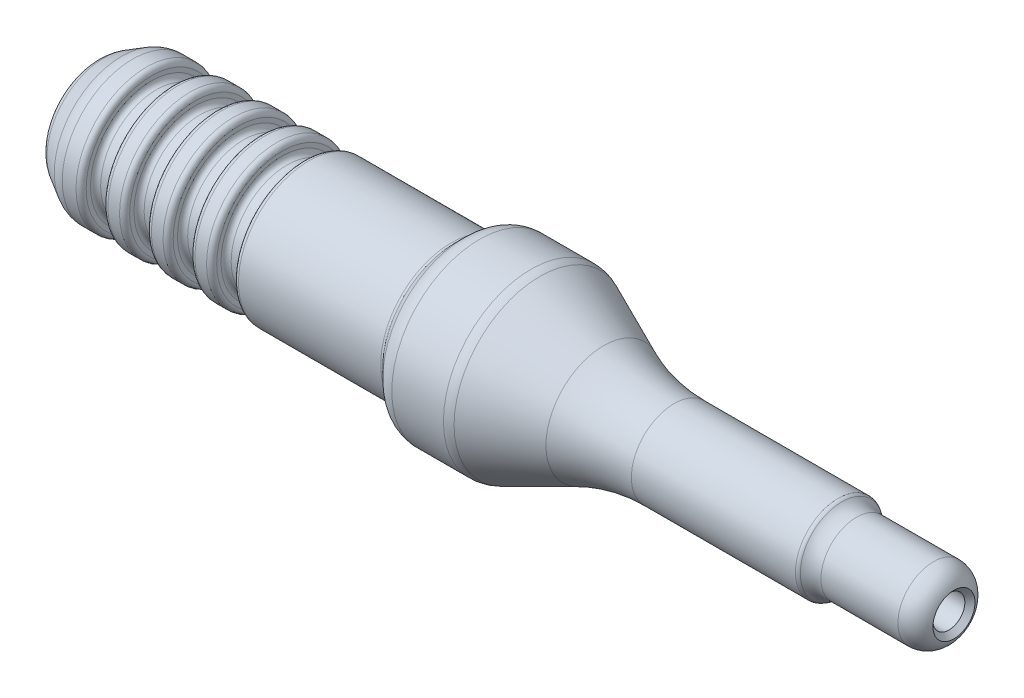
ISO-10303-21;
HEADER;
FILE_DESCRIPTION(('STEP AP214'),'2;1');
FILE_NAME('part.step','',(''),(''),'','','');
FILE_SCHEMA(('AUTOMOTIVE_DESIGN { 1 0 10303 214 1 1 1 1 }'));
ENDSEC;
DATA;
#1=APPLICATION_CONTEXT('core data for automotive mechanical design processes');
#2=APPLICATION_PROTOCOL_DEFINITION('international standard','automotive_design',2000,#1);
#3=PRODUCT_CONTEXT('',#1,'mechanical');
#4=PRODUCT('Part','Part','',(#3));
#5=PRODUCT_RELATED_PRODUCT_CATEGORY('part','',(#4));
#6=PRODUCT_DEFINITION_FORMATION('','',#4);
#7=PRODUCT_DEFINITION_CONTEXT('part definition',#1,'design');
#8=PRODUCT_DEFINITION('design','',#6,#7);
#9=PRODUCT_DEFINITION_SHAPE('','',#8);
#10=(LENGTH_UNIT() NAMED_UNIT(*) SI_UNIT(.MILLI.,.METRE.));
#11=(NAMED_UNIT(*) PLANE_ANGLE_UNIT() SI_UNIT($,.RADIAN.));
#12=(NAMED_UNIT(*) SI_UNIT($,.STERADIAN.) SOLID_ANGLE_UNIT());
#13=UNCERTAINTY_MEASURE_WITH_UNIT(LENGTH_MEASURE(1.E-05),#10,'distance_accuracy_value','');
#14=(GEOMETRIC_REPRESENTATION_CONTEXT(3) GLOBAL_UNCERTAINTY_ASSIGNED_CONTEXT((#13)) GLOBAL_UNIT_ASSIGNED_CONTEXT((#10,
#11,#12)) REPRESENTATION_CONTEXT('',''));
#15=CARTESIAN_POINT('',(0.,0.,0.));
#16=DIRECTION('',(0.,0.,1.));
#17=DIRECTION('',(1.,0.,0.));
#18=AXIS2_PLACEMENT_3D('',#15,#16,#17);
#19=CARTESIAN_POINT('',(59.3371706320249,0.,0.));
#20=DIRECTION('',(1.,0.,0.));
#21=DIRECTION('',(0.,0.,-1.));
#22=AXIS2_PLACEMENT_3D('',#19,#20,#21);
#23=CYLINDRICAL_SURFACE('',#22,4.84790561913614);
#24=CARTESIAN_POINT('',(14.85,0.,0.));
#25=DIRECTION('',(1.,0.,0.));
#26=DIRECTION('',(0.,0.,-1.));
#27=AXIS2_PLACEMENT_3D('',#24,#25,#26);
#28=CIRCLE('',#27,4.84790561913614);
#29=CARTESIAN_POINT('',(14.85,0.,-4.84790561913614));
#30=VERTEX_POINT('',#29);
#31=EDGE_CURVE('E132',#30,#30,#28,.T.);
#32=ORIENTED_EDGE('',*,*,#31,.T.);
#33=EDGE_LOOP('',(#32));
#34=FACE_BOUND('',#33,.T.);
#35=CARTESIAN_POINT('',(24.6550252531694,0.,0.));
#36=DIRECTION('',(1.,0.,0.));
#37=DIRECTION('',(0.,0.,-1.));
#38=AXIS2_PLACEMENT_3D('',#35,#36,#37);
#39=CIRCLE('',#38,4.84790561913614);
#40=CARTESIAN_POINT('',(24.6550252531694,0.,-4.84790561913614));
#41=VERTEX_POINT('',#40);
#42=EDGE_CURVE('E135',#41,#41,#39,.F.);
#43=ORIENTED_EDGE('',*,*,#42,.T.);
#44=EDGE_LOOP('',(#43));
#45=FACE_BOUND('',#44,.T.);
#46=ADVANCED_FACE('F34',(#34,#45),#23,.T.);
#47=CARTESIAN_POINT('',(26.,0.,0.));
#48=DIRECTION('',(1.,0.,0.));
#49=DIRECTION('',(0.,0.,-1.));
#50=AXIS2_PLACEMENT_3D('',#47,#48,#49);
#51=CONICAL_SURFACE('',#50,6.04790561913615,0.785398163397448);
#52=CARTESIAN_POINT('',(24.9025126265847,0.,0.));
#53=DIRECTION('',(1.,0.,0.));
#54=DIRECTION('',(0.,0.,-1.));
#55=AXIS2_PLACEMENT_3D('',#52,#53,#54);
#56=CIRCLE('',#55,4.95041824572085);
#57=CARTESIAN_POINT('',(24.9025126265847,0.,-4.95041824572085));
#58=VERTEX_POINT('',#57);
#59=EDGE_CURVE('E10',#58,#58,#56,.T.);
#60=ORIENTED_EDGE('',*,*,#59,.T.);
#61=EDGE_LOOP('',(#60));
#62=FACE_BOUND('',#61,.T.);
#63=CARTESIAN_POINT('',(25.5606601717798,0.,0.));
#64=DIRECTION('',(-1.,0.,0.));
#65=DIRECTION('',(0.,0.,1.));
#66=AXIS2_PLACEMENT_3D('',#63,#64,#65);
#67=CIRCLE('',#66,5.60856579091597);
#68=CARTESIAN_POINT('',(25.5606601717798,0.,5.60856579091597));
#69=VERTEX_POINT('',#68);
#70=EDGE_CURVE('E159',#69,#69,#67,.T.);
#71=ORIENTED_EDGE('',*,*,#70,.T.);
#72=EDGE_LOOP('',(#71));
#73=FACE_BOUND('',#72,.T.);
#74=ADVANCED_FACE('F218',(#62,#73),#51,.T.);
#75=CARTESIAN_POINT('',(59.3371706320249,0.,0.));
#76=DIRECTION('',(1.,0.,0.));
#77=DIRECTION('',(0.,0.,-1.));
#78=AXIS2_PLACEMENT_3D('',#75,#76,#77);
#79=CYLINDRICAL_SURFACE('',#78,6.04790561913615);
#80=CARTESIAN_POINT('',(26.6213203435596,0.,0.));
#81=DIRECTION('',(-1.,0.,0.));
#82=DIRECTION('',(0.,0.,1.));
#83=AXIS2_PLACEMENT_3D('',#80,#81,#82);
#84=CIRCLE('',#83,6.04790561913615);
#85=CARTESIAN_POINT('',(26.6213203435596,0.,6.04790561913615));
#86=VERTEX_POINT('',#85);
#87=EDGE_CURVE('E162',#86,#86,#84,.F.);
#88=ORIENTED_EDGE('',*,*,#87,.T.);
#89=EDGE_LOOP('',(#88));
#90=FACE_BOUND('',#89,.T.);
#91=CARTESIAN_POINT('',(30.182669802533,0.,0.));
#92=DIRECTION('',(-1.,0.,0.));
#93=DIRECTION('',(0.,0.,1.));
#94=AXIS2_PLACEMENT_3D('',#91,#92,#93);
#95=CIRCLE('',#94,6.04790561913615);
#96=CARTESIAN_POINT('',(30.182669802533,0.,6.04790561913615));
#97=VERTEX_POINT('',#96);
#98=EDGE_CURVE('E165',#97,#97,#95,.T.);
#99=ORIENTED_EDGE('',*,*,#98,.T.);
#100=EDGE_LOOP('',(#99));
#101=FACE_BOUND('',#100,.T.);
#102=ADVANCED_FACE('F226',(#90,#101),#79,.T.);
#103=CARTESIAN_POINT('',(37.5,0.,0.));
#104=DIRECTION('',(-1.,0.,0.));
#105=DIRECTION('',(0.,0.,1.));
#106=AXIS2_PLACEMENT_3D('',#103,#104,#105);
#107=CONICAL_SURFACE('',#106,2.94739412510884,0.416959158301446);
#108=CARTESIAN_POINT('',(30.7901428223222,0.,0.));
#109=DIRECTION('',(1.,0.,0.));
#110=DIRECTION('',(0.,0.,-1.));
#111=AXIS2_PLACEMENT_3D('',#108,#109,#110);
#112=CIRCLE('',#111,5.91939259691907);
#113=CARTESIAN_POINT('',(30.7901428223222,0.,-5.91939259691907));
#114=VERTEX_POINT('',#113);
#115=EDGE_CURVE('E156',#114,#114,#112,.T.);
#116=ORIENTED_EDGE('',*,*,#115,.T.);
#117=EDGE_LOOP('',(#116));
#118=FACE_BOUND('',#117,.T.);
#119=CARTESIAN_POINT('',(35.1788574214223,0.,0.));
#120=DIRECTION('',(-1.,0.,0.));
#121=DIRECTION('',(0.,0.,1.));
#122=AXIS2_PLACEMENT_3D('',#119,#120,#121);
#123=CIRCLE('',#122,3.97549830284546);
#124=CARTESIAN_POINT('',(35.1788574214223,0.,3.97549830284546));
#125=VERTEX_POINT('',#124);
#126=EDGE_CURVE('E183',#125,#125,#123,.T.);
#127=ORIENTED_EDGE('',*,*,#126,.T.);
#128=EDGE_LOOP('',(#127));
#129=FACE_BOUND('',#128,.T.);
#130=ADVANCED_FACE('F394',(#118,#129),#107,.T.);
#131=CARTESIAN_POINT('',(59.3371706320249,0.,0.));
#132=DIRECTION('',(1.,0.,0.));
#133=DIRECTION('',(0.,0.,-1.));
#134=AXIS2_PLACEMENT_3D('',#131,#132,#133);
#135=CYLINDRICAL_SURFACE('',#134,2.94739412510884);
#136=CARTESIAN_POINT('',(51.3535736046771,0.,0.));
#137=DIRECTION('',(-1.,0.,0.));
#138=DIRECTION('',(0.,0.,1.));
#139=AXIS2_PLACEMENT_3D('',#136,#137,#138);
#140=CIRCLE('',#139,2.94739412510884);
#141=CARTESIAN_POINT('',(51.3535736046771,0.,2.94739412510884));
#142=VERTEX_POINT('',#141);
#143=EDGE_CURVE('E41',#142,#142,#140,.T.);
#144=ORIENTED_EDGE('',*,*,#143,.T.);
#145=EDGE_LOOP('',(#144));
#146=FACE_BOUND('',#145,.T.);
#147=CARTESIAN_POINT('',(40.0386415797363,0.,0.));
#148=DIRECTION('',(1.,0.,0.));
#149=DIRECTION('',(0.,0.,-1.));
#150=AXIS2_PLACEMENT_3D('',#147,#148,#149);
#151=CIRCLE('',#150,2.94739412510884);
#152=CARTESIAN_POINT('',(40.0386415797363,0.,-2.94739412510884));
#153=VERTEX_POINT('',#152);
#154=EDGE_CURVE('E186',#153,#153,#151,.T.);
#155=ORIENTED_EDGE('',*,*,#154,.T.);
#156=EDGE_LOOP('',(#155));
#157=FACE_BOUND('',#156,.T.);
#158=ADVANCED_FACE('F385',(#146,#157),#135,.T.);
#159=CARTESIAN_POINT('',(59.3371706320249,0.,0.));
#160=DIRECTION('',(1.,0.,0.));
#161=DIRECTION('',(0.,0.,-1.));
#162=AXIS2_PLACEMENT_3D('',#159,#160,#161);
#163=CYLINDRICAL_SURFACE('',#162,2.45);
#164=CARTESIAN_POINT('',(57.9229570696518,0.,0.));
#165=DIRECTION('',(1.,0.,0.));
#166=DIRECTION('',(0.,0.,-1.));
#167=AXIS2_PLACEMENT_3D('',#164,#165,#166);
#168=CIRCLE('',#167,2.45);
#169=CARTESIAN_POINT('',(57.9229570696518,0.,-2.45));
#170=VERTEX_POINT('',#169);
#171=EDGE_CURVE('E150',#170,#170,#168,.F.);
#172=ORIENTED_EDGE('',*,*,#171,.T.);
#173=EDGE_LOOP('',(#172));
#174=FACE_BOUND('',#173,.T.);
#175=CARTESIAN_POINT('',(52.6156977456434,0.,0.));
#176=DIRECTION('',(-1.,0.,0.));
#177=DIRECTION('',(0.,0.,1.));
#178=AXIS2_PLACEMENT_3D('',#175,#176,#177);
#179=CIRCLE('',#178,2.45);
#180=CARTESIAN_POINT('',(52.6156977456434,0.,2.45));
#181=VERTEX_POINT('',#180);
#182=EDGE_CURVE('E153',#181,#181,#179,.F.);
#183=ORIENTED_EDGE('',*,*,#182,.T.);
#184=EDGE_LOOP('',(#183));
#185=FACE_BOUND('',#184,.T.);
#186=ADVANCED_FACE('F383',(#174,#185),#163,.T.);
#187=CARTESIAN_POINT('',(59.3371706320249,0.,0.));
#188=DIRECTION('',(1.,0.,0.));
#189=DIRECTION('',(0.,0.,-1.));
#190=AXIS2_PLACEMENT_3D('',#187,#188,#189);
#191=CYLINDRICAL_SURFACE('',#190,2.7);
#192=CARTESIAN_POINT('',(0.,0.,0.));
#193=DIRECTION('',(1.,0.,0.));
#194=DIRECTION('',(0.,0.,-1.));
#195=AXIS2_PLACEMENT_3D('',#192,#193,#194);
#196=CIRCLE('',#195,2.7);
#197=CARTESIAN_POINT('',(0.,0.,-2.7));
#198=VERTEX_POINT('',#197);
#199=EDGE_CURVE('E189',#198,#198,#196,.T.);
#200=ORIENTED_EDGE('',*,*,#199,.F.);
#201=EDGE_LOOP('',(#200));
#202=FACE_BOUND('',#201,.T.);
#203=CARTESIAN_POINT('',(33.5,0.,0.));
#204=DIRECTION('',(1.,0.,0.));
#205=DIRECTION('',(0.,0.,-1.));
#206=AXIS2_PLACEMENT_3D('',#203,#204,#205);
#207=CIRCLE('',#206,2.7);
#208=CARTESIAN_POINT('',(33.5,0.,-2.7));
#209=VERTEX_POINT('',#208);
#210=EDGE_CURVE('E192',#209,#209,#207,.T.);
#211=ORIENTED_EDGE('',*,*,#210,.T.);
#212=EDGE_LOOP('',(#211));
#213=FACE_BOUND('',#212,.T.);
#214=ADVANCED_FACE('F213',(#202,#213),#191,.F.);
#215=CARTESIAN_POINT('',(36.2712812921102,0.,0.));
#216=DIRECTION('',(-1.,0.,0.));
#217=DIRECTION('',(0.,0.,1.));
#218=AXIS2_PLACEMENT_3D('',#215,#216,#217);
#219=CONICAL_SURFACE('',#218,1.1,0.5235987755983);
#220=ORIENTED_EDGE('',*,*,#210,.F.);
#221=EDGE_LOOP('',(#220));
#222=FACE_BOUND('',#221,.T.);
#223=CARTESIAN_POINT('',(36.2712812921102,0.,0.));
#224=DIRECTION('',(1.,0.,0.));
#225=DIRECTION('',(0.,0.,-1.));
#226=AXIS2_PLACEMENT_3D('',#223,#224,#225);
#227=CIRCLE('',#226,1.1);
#228=CARTESIAN_POINT('',(36.2712812921102,0.,-1.1));
#229=VERTEX_POINT('',#228);
#230=EDGE_CURVE('E195',#229,#229,#227,.T.);
#231=ORIENTED_EDGE('',*,*,#230,.T.);
#232=EDGE_LOOP('',(#231));
#233=FACE_BOUND('',#232,.T.);
#234=ADVANCED_FACE('F199',(#222,#233),#219,.F.);
#235=CARTESIAN_POINT('',(59.3371706320249,0.,0.));
#236=DIRECTION('',(1.,0.,0.));
#237=DIRECTION('',(0.,0.,-1.));
#238=AXIS2_PLACEMENT_3D('',#235,#236,#237);
#239=CYLINDRICAL_SURFACE('',#238,1.1);
#240=CARTESIAN_POINT('',(58.9871706320249,0.,0.));
#241=DIRECTION('',(1.,0.,0.));
#242=DIRECTION('',(0.,0.,-1.));
#243=AXIS2_PLACEMENT_3D('',#240,#241,#242);
#244=CIRCLE('',#243,1.1);
#245=CARTESIAN_POINT('',(58.9871706320249,0.,-1.1));
#246=VERTEX_POINT('',#245);
#247=EDGE_CURVE('E180',#246,#246,#244,.T.);
#248=ORIENTED_EDGE('',*,*,#247,.T.);
#249=EDGE_LOOP('',(#248));
#250=FACE_BOUND('',#249,.T.);
#251=ORIENTED_EDGE('',*,*,#230,.F.);
#252=EDGE_LOOP('',(#251));
#253=FACE_BOUND('',#252,.T.);
#254=ADVANCED_FACE('F201',(#250,#253),#239,.F.);
#255=CARTESIAN_POINT('',(2.3,0.,0.));
#256=DIRECTION('',(1.,0.,0.));
#257=DIRECTION('',(0.,0.,-1.));
#258=AXIS2_PLACEMENT_3D('',#255,#256,#257);
#259=CONICAL_SURFACE('',#258,4.84790561913614,0.523598775598301);
#260=CARTESIAN_POINT('',(1.95192378864668,0.,0.));
#261=DIRECTION('',(-1.,0.,0.));
#262=DIRECTION('',(0.,0.,1.));
#263=AXIS2_PLACEMENT_3D('',#260,#261,#262);
#264=CIRCLE('',#263,4.6469437248128);
#265=CARTESIAN_POINT('',(1.95192378864668,0.,4.6469437248128));
#266=VERTEX_POINT('',#265);
#267=EDGE_CURVE('E168',#266,#266,#264,.T.);
#268=ORIENTED_EDGE('',*,*,#267,.T.);
#269=EDGE_LOOP('',(#268));
#270=FACE_BOUND('',#269,.T.);
#271=CARTESIAN_POINT('',(0.749280918934958,0.,0.));
#272=DIRECTION('',(1.,0.,0.));
#273=DIRECTION('',(0.,0.,-1.));
#274=AXIS2_PLACEMENT_3D('',#271,#272,#273);
#275=CIRCLE('',#274,3.95259754024575);
#276=CARTESIAN_POINT('',(0.749280918934958,0.,-3.95259754024575));
#277=VERTEX_POINT('',#276);
#278=EDGE_CURVE('E171',#277,#277,#275,.T.);
#279=ORIENTED_EDGE('',*,*,#278,.T.);
#280=EDGE_LOOP('',(#279));
#281=FACE_BOUND('',#280,.T.);
#282=ADVANCED_FACE('F203',(#270,#281),#259,.T.);
#283=CARTESIAN_POINT('',(3.65,0.,0.));
#284=DIRECTION('',(-1.,0.,0.));
#285=DIRECTION('',(0.,0.,1.));
#286=AXIS2_PLACEMENT_3D('',#283,#284,#285);
#287=CIRCLE('',#286,4.84790561913614);
#288=CARTESIAN_POINT('',(3.65,0.,4.84790561913614));
#289=VERTEX_POINT('',#288);
#290=EDGE_CURVE('E57',#289,#289,#287,.T.);
#291=ORIENTED_EDGE('',*,*,#290,.T.);
#292=EDGE_LOOP('',(#291));
#293=FACE_BOUND('',#292,.T.);
#294=CARTESIAN_POINT('',(2.70192378864668,0.,0.));
#295=DIRECTION('',(-1.,0.,0.));
#296=DIRECTION('',(0.,0.,1.));
#297=AXIS2_PLACEMENT_3D('',#294,#295,#296);
#298=CIRCLE('',#297,4.84790561913614);
#299=CARTESIAN_POINT('',(2.70192378864668,0.,4.84790561913614));
#300=VERTEX_POINT('',#299);
#301=EDGE_CURVE('E174',#300,#300,#298,.F.);
#302=ORIENTED_EDGE('',*,*,#301,.T.);
#303=EDGE_LOOP('',(#302));
#304=FACE_BOUND('',#303,.T.);
#305=ADVANCED_FACE('F210',(#293,#304),#23,.T.);
#306=CARTESIAN_POINT('',(59.3371706320249,0.,0.));
#307=DIRECTION('',(1.,0.,0.));
#308=DIRECTION('',(0.,0.,-1.));
#309=AXIS2_PLACEMENT_3D('',#306,#307,#308);
#310=CYLINDRICAL_SURFACE('',#309,3.84999999999999);
#311=CARTESIAN_POINT('',(14.15,0.,0.));
#312=DIRECTION('',(1.,0.,0.));
#313=DIRECTION('',(0.,0.,-1.));
#314=AXIS2_PLACEMENT_3D('',#311,#312,#313);
#315=CIRCLE('',#314,3.84999999999999);
#316=CARTESIAN_POINT('',(14.15,0.,-3.84999999999999));
#317=VERTEX_POINT('',#316);
#318=EDGE_CURVE('E138',#317,#317,#315,.F.);
#319=ORIENTED_EDGE('',*,*,#318,.T.);
#320=EDGE_LOOP('',(#319));
#321=FACE_BOUND('',#320,.T.);
#322=CARTESIAN_POINT('',(13.35,0.,0.));
#323=DIRECTION('',(-1.,0.,0.));
#324=DIRECTION('',(0.,0.,1.));
#325=AXIS2_PLACEMENT_3D('',#322,#323,#324);
#326=CIRCLE('',#325,3.84999999999999);
#327=CARTESIAN_POINT('',(13.35,0.,3.84999999999999));
#328=VERTEX_POINT('',#327);
#329=EDGE_CURVE('E141',#328,#328,#326,.F.);
#330=ORIENTED_EDGE('',*,*,#329,.T.);
#331=EDGE_LOOP('',(#330));
#332=FACE_BOUND('',#331,.T.);
#333=ADVANCED_FACE('F244',(#321,#332),#310,.T.);
#334=CARTESIAN_POINT('',(14.5,3.84999999999999,0.));
#335=DIRECTION('',(1.,0.,0.));
#336=DIRECTION('',(0.,0.,-1.));
#337=AXIS2_PLACEMENT_3D('',#334,#335,#336);
#338=PLANE('',#337);
#339=CARTESIAN_POINT('',(14.5,0.,0.));
#340=DIRECTION('',(1.,0.,0.));
#341=DIRECTION('',(0.,0.,-1.));
#342=AXIS2_PLACEMENT_3D('',#339,#340,#341);
#343=CIRCLE('',#342,4.19999999999999);
#344=CARTESIAN_POINT('',(14.5,0.,-4.19999999999999));
#345=VERTEX_POINT('',#344);
#346=EDGE_CURVE('E144',#345,#345,#343,.T.);
#347=ORIENTED_EDGE('',*,*,#346,.T.);
#348=EDGE_LOOP('',(#347));
#349=FACE_BOUND('',#348,.T.);
#350=CARTESIAN_POINT('',(14.5,0.,0.));
#351=DIRECTION('',(1.,0.,0.));
#352=DIRECTION('',(0.,0.,-1.));
#353=AXIS2_PLACEMENT_3D('',#350,#351,#352);
#354=CIRCLE('',#353,4.49790561913615);
#355=CARTESIAN_POINT('',(14.5,0.,-4.49790561913615));
#356=VERTEX_POINT('',#355);
#357=EDGE_CURVE('E147',#356,#356,#354,.F.);
#358=ORIENTED_EDGE('',*,*,#357,.T.);
#359=EDGE_LOOP('',(#358));
#360=FACE_BOUND('',#359,.T.);
#361=ADVANCED_FACE('F249',(#349,#360),#338,.F.);
#362=CARTESIAN_POINT('',(13.,3.84999999999999,0.));
#363=DIRECTION('',(-1.,0.,0.));
#364=DIRECTION('',(0.,0.,1.));
#365=AXIS2_PLACEMENT_3D('',#362,#363,#364);
#366=PLANE('',#365);
#367=CARTESIAN_POINT('',(13.,0.,0.));
#368=DIRECTION('',(-1.,0.,0.));
#369=DIRECTION('',(0.,0.,1.));
#370=AXIS2_PLACEMENT_3D('',#367,#368,#369);
#371=CIRCLE('',#370,4.19999999999999);
#372=CARTESIAN_POINT('',(13.,0.,4.19999999999999));
#373=VERTEX_POINT('',#372);
#374=EDGE_CURVE('E126',#373,#373,#371,.T.);
#375=ORIENTED_EDGE('',*,*,#374,.T.);
#376=EDGE_LOOP('',(#375));
#377=FACE_BOUND('',#376,.T.);
#378=CARTESIAN_POINT('',(13.,0.,0.));
#379=DIRECTION('',(-1.,0.,0.));
#380=DIRECTION('',(0.,0.,1.));
#381=AXIS2_PLACEMENT_3D('',#378,#379,#380);
#382=CIRCLE('',#381,4.49790561913615);
#383=CARTESIAN_POINT('',(13.,0.,4.49790561913615));
#384=VERTEX_POINT('',#383);
#385=EDGE_CURVE('E129',#384,#384,#382,.F.);
#386=ORIENTED_EDGE('',*,*,#385,.T.);
#387=EDGE_LOOP('',(#386));
#388=FACE_BOUND('',#387,.T.);
#389=ADVANCED_FACE('F292',(#377,#388),#366,.F.);
#390=CARTESIAN_POINT('',(4.,3.84999999999999,0.));
#391=DIRECTION('',(-1.,0.,0.));
#392=DIRECTION('',(0.,0.,1.));
#393=AXIS2_PLACEMENT_3D('',#390,#391,#392);
#394=PLANE('',#393);
#395=CARTESIAN_POINT('',(4.,0.,0.));
#396=DIRECTION('',(-1.,0.,0.));
#397=DIRECTION('',(0.,0.,1.));
#398=AXIS2_PLACEMENT_3D('',#395,#396,#397);
#399=CIRCLE('',#398,4.19999999999999);
#400=CARTESIAN_POINT('',(4.,0.,4.19999999999999));
#401=VERTEX_POINT('',#400);
#402=EDGE_CURVE('E60',#401,#401,#399,.T.);
#403=ORIENTED_EDGE('',*,*,#402,.T.);
#404=EDGE_LOOP('',(#403));
#405=FACE_BOUND('',#404,.T.);
#406=CARTESIAN_POINT('',(4.,0.,0.));
#407=DIRECTION('',(-1.,0.,0.));
#408=DIRECTION('',(0.,0.,1.));
#409=AXIS2_PLACEMENT_3D('',#406,#407,#408);
#410=CIRCLE('',#409,4.49790561913615);
#411=CARTESIAN_POINT('',(4.,0.,4.49790561913615));
#412=VERTEX_POINT('',#411);
#413=EDGE_CURVE('E63',#412,#412,#410,.F.);
#414=ORIENTED_EDGE('',*,*,#413,.T.);
#415=EDGE_LOOP('',(#414));
#416=FACE_BOUND('',#415,.T.);
#417=ADVANCED_FACE('F295',(#405,#416),#394,.F.);
#418=CARTESIAN_POINT('',(5.5,3.84999999999999,0.));
#419=DIRECTION('',(1.,0.,0.));
#420=DIRECTION('',(0.,0.,-1.));
#421=AXIS2_PLACEMENT_3D('',#418,#419,#420);
#422=PLANE('',#421);
#423=CARTESIAN_POINT('',(5.5,0.,0.));
#424=DIRECTION('',(1.,0.,0.));
#425=DIRECTION('',(0.,0.,-1.));
#426=AXIS2_PLACEMENT_3D('',#423,#424,#425);
#427=CIRCLE('',#426,4.19999999999999);
#428=CARTESIAN_POINT('',(5.5,0.,-4.19999999999999));
#429=VERTEX_POINT('',#428);
#430=EDGE_CURVE('E49',#429,#429,#427,.T.);
#431=ORIENTED_EDGE('',*,*,#430,.T.);
#432=EDGE_LOOP('',(#431));
#433=FACE_BOUND('',#432,.T.);
#434=CARTESIAN_POINT('',(5.5,0.,0.));
#435=DIRECTION('',(1.,0.,0.));
#436=DIRECTION('',(0.,0.,-1.));
#437=AXIS2_PLACEMENT_3D('',#434,#435,#436);
#438=CIRCLE('',#437,4.49790561913615);
#439=CARTESIAN_POINT('',(5.5,0.,-4.49790561913615));
#440=VERTEX_POINT('',#439);
#441=EDGE_CURVE('E54',#440,#440,#438,.F.);
#442=ORIENTED_EDGE('',*,*,#441,.T.);
#443=EDGE_LOOP('',(#442));
#444=FACE_BOUND('',#443,.T.);
#445=ADVANCED_FACE('F630',(#433,#444),#422,.F.);
#446=CARTESIAN_POINT('',(59.3371706320249,0.,0.));
#447=DIRECTION('',(1.,0.,0.));
#448=DIRECTION('',(0.,0.,-1.));
#449=AXIS2_PLACEMENT_3D('',#446,#447,#448);
#450=CYLINDRICAL_SURFACE('',#449,3.84999999999999);
#451=CARTESIAN_POINT('',(4.35,0.,0.));
#452=DIRECTION('',(-1.,0.,0.));
#453=DIRECTION('',(0.,0.,1.));
#454=AXIS2_PLACEMENT_3D('',#451,#452,#453);
#455=CIRCLE('',#454,3.84999999999999);
#456=CARTESIAN_POINT('',(4.35,0.,3.84999999999999));
#457=VERTEX_POINT('',#456);
#458=EDGE_CURVE('E66',#457,#457,#455,.F.);
#459=ORIENTED_EDGE('',*,*,#458,.T.);
#460=EDGE_LOOP('',(#459));
#461=FACE_BOUND('',#460,.T.);
#462=CARTESIAN_POINT('',(5.15,0.,0.));
#463=DIRECTION('',(1.,0.,0.));
#464=DIRECTION('',(0.,0.,-1.));
#465=AXIS2_PLACEMENT_3D('',#462,#463,#464);
#466=CIRCLE('',#465,3.84999999999999);
#467=CARTESIAN_POINT('',(5.15,0.,-3.84999999999999));
#468=VERTEX_POINT('',#467);
#469=EDGE_CURVE('E69',#468,#468,#466,.F.);
#470=ORIENTED_EDGE('',*,*,#469,.T.);
#471=EDGE_LOOP('',(#470));
#472=FACE_BOUND('',#471,.T.);
#473=ADVANCED_FACE('F230',(#461,#472),#450,.T.);
#474=CARTESIAN_POINT('',(12.65,0.,0.));
#475=DIRECTION('',(-1.,0.,0.));
#476=DIRECTION('',(0.,0.,1.));
#477=AXIS2_PLACEMENT_3D('',#474,#475,#476);
#478=CIRCLE('',#477,4.84790561913614);
#479=CARTESIAN_POINT('',(12.65,0.,4.84790561913614));
#480=VERTEX_POINT('',#479);
#481=EDGE_CURVE('E120',#480,#480,#478,.T.);
#482=ORIENTED_EDGE('',*,*,#481,.T.);
#483=EDGE_LOOP('',(#482));
#484=FACE_BOUND('',#483,.T.);
#485=CARTESIAN_POINT('',(11.85,0.,0.));
#486=DIRECTION('',(1.,0.,0.));
#487=DIRECTION('',(0.,0.,-1.));
#488=AXIS2_PLACEMENT_3D('',#485,#486,#487);
#489=CIRCLE('',#488,4.84790561913614);
#490=CARTESIAN_POINT('',(11.85,0.,-4.84790561913614));
#491=VERTEX_POINT('',#490);
#492=EDGE_CURVE('E123',#491,#491,#489,.T.);
#493=ORIENTED_EDGE('',*,*,#492,.T.);
#494=EDGE_LOOP('',(#493));
#495=FACE_BOUND('',#494,.T.);
#496=ADVANCED_FACE('F221',(#484,#495),#23,.T.);
#497=CARTESIAN_POINT('',(6.65,0.,0.));
#498=DIRECTION('',(-1.,0.,0.));
#499=DIRECTION('',(0.,0.,1.));
#500=AXIS2_PLACEMENT_3D('',#497,#498,#499);
#501=CIRCLE('',#500,4.84790561913614);
#502=CARTESIAN_POINT('',(6.65,0.,4.84790561913614));
#503=VERTEX_POINT('',#502);
#504=EDGE_CURVE('E72',#503,#503,#501,.T.);
#505=ORIENTED_EDGE('',*,*,#504,.T.);
#506=EDGE_LOOP('',(#505));
#507=FACE_BOUND('',#506,.T.);
#508=CARTESIAN_POINT('',(5.85,0.,0.));
#509=DIRECTION('',(1.,0.,0.));
#510=DIRECTION('',(0.,0.,-1.));
#511=AXIS2_PLACEMENT_3D('',#508,#509,#510);
#512=CIRCLE('',#511,4.84790561913614);
#513=CARTESIAN_POINT('',(5.85,0.,-4.84790561913614));
#514=VERTEX_POINT('',#513);
#515=EDGE_CURVE('E75',#514,#514,#512,.T.);
#516=ORIENTED_EDGE('',*,*,#515,.T.);
#517=EDGE_LOOP('',(#516));
#518=FACE_BOUND('',#517,.T.);
#519=ADVANCED_FACE('F222',(#507,#518),#23,.T.);
#520=CARTESIAN_POINT('',(59.3371706320249,0.,0.));
#521=DIRECTION('',(1.,0.,0.));
#522=DIRECTION('',(0.,0.,-1.));
#523=AXIS2_PLACEMENT_3D('',#520,#521,#522);
#524=CYLINDRICAL_SURFACE('',#523,3.84999999999999);
#525=CARTESIAN_POINT('',(8.15,0.,0.));
#526=DIRECTION('',(1.,0.,0.));
#527=DIRECTION('',(0.,0.,-1.));
#528=AXIS2_PLACEMENT_3D('',#525,#526,#527);
#529=CIRCLE('',#528,3.84999999999999);
#530=CARTESIAN_POINT('',(8.15,0.,-3.84999999999999));
#531=VERTEX_POINT('',#530);
#532=EDGE_CURVE('E84',#531,#531,#529,.F.);
#533=ORIENTED_EDGE('',*,*,#532,.T.);
#534=EDGE_LOOP('',(#533));
#535=FACE_BOUND('',#534,.T.);
#536=CARTESIAN_POINT('',(7.35,0.,0.));
#537=DIRECTION('',(-1.,0.,0.));
#538=DIRECTION('',(0.,0.,1.));
#539=AXIS2_PLACEMENT_3D('',#536,#537,#538);
#540=CIRCLE('',#539,3.84999999999999);
#541=CARTESIAN_POINT('',(7.35,0.,3.84999999999999));
#542=VERTEX_POINT('',#541);
#543=EDGE_CURVE('E87',#542,#542,#540,.F.);
#544=ORIENTED_EDGE('',*,*,#543,.T.);
#545=EDGE_LOOP('',(#544));
#546=FACE_BOUND('',#545,.T.);
#547=ADVANCED_FACE('F234',(#535,#546),#524,.T.);
#548=CARTESIAN_POINT('',(8.5,3.84999999999999,0.));
#549=DIRECTION('',(1.,0.,0.));
#550=DIRECTION('',(0.,0.,-1.));
#551=AXIS2_PLACEMENT_3D('',#548,#549,#550);
#552=PLANE('',#551);
#553=CARTESIAN_POINT('',(8.5,0.,0.));
#554=DIRECTION('',(1.,0.,0.));
#555=DIRECTION('',(0.,0.,-1.));
#556=AXIS2_PLACEMENT_3D('',#553,#554,#555);
#557=CIRCLE('',#556,4.19999999999999);
#558=CARTESIAN_POINT('',(8.5,0.,-4.19999999999999));
#559=VERTEX_POINT('',#558);
#560=EDGE_CURVE('E90',#559,#559,#557,.T.);
#561=ORIENTED_EDGE('',*,*,#560,.T.);
#562=EDGE_LOOP('',(#561));
#563=FACE_BOUND('',#562,.T.);
#564=CARTESIAN_POINT('',(8.5,0.,0.));
#565=DIRECTION('',(1.,0.,0.));
#566=DIRECTION('',(0.,0.,-1.));
#567=AXIS2_PLACEMENT_3D('',#564,#565,#566);
#568=CIRCLE('',#567,4.49790561913615);
#569=CARTESIAN_POINT('',(8.5,0.,-4.49790561913615));
#570=VERTEX_POINT('',#569);
#571=EDGE_CURVE('E93',#570,#570,#568,.F.);
#572=ORIENTED_EDGE('',*,*,#571,.T.);
#573=EDGE_LOOP('',(#572));
#574=FACE_BOUND('',#573,.T.);
#575=ADVANCED_FACE('F239',(#563,#574),#552,.F.);
#576=CARTESIAN_POINT('',(7.,3.84999999999999,0.));
#577=DIRECTION('',(-1.,0.,0.));
#578=DIRECTION('',(0.,0.,1.));
#579=AXIS2_PLACEMENT_3D('',#576,#577,#578);
#580=PLANE('',#579);
#581=CARTESIAN_POINT('',(7.,0.,0.));
#582=DIRECTION('',(-1.,0.,0.));
#583=DIRECTION('',(0.,0.,1.));
#584=AXIS2_PLACEMENT_3D('',#581,#582,#583);
#585=CIRCLE('',#584,4.19999999999999);
#586=CARTESIAN_POINT('',(7.,0.,4.19999999999999));
#587=VERTEX_POINT('',#586);
#588=EDGE_CURVE('E78',#587,#587,#585,.T.);
#589=ORIENTED_EDGE('',*,*,#588,.T.);
#590=EDGE_LOOP('',(#589));
#591=FACE_BOUND('',#590,.T.);
#592=CARTESIAN_POINT('',(7.,0.,0.));
#593=DIRECTION('',(-1.,0.,0.));
#594=DIRECTION('',(0.,0.,1.));
#595=AXIS2_PLACEMENT_3D('',#592,#593,#594);
#596=CIRCLE('',#595,4.49790561913615);
#597=CARTESIAN_POINT('',(7.,0.,4.49790561913615));
#598=VERTEX_POINT('',#597);
#599=EDGE_CURVE('E81',#598,#598,#596,.F.);
#600=ORIENTED_EDGE('',*,*,#599,.T.);
#601=EDGE_LOOP('',(#600));
#602=FACE_BOUND('',#601,.T.);
#603=ADVANCED_FACE('F254',(#591,#602),#580,.F.);
#604=CARTESIAN_POINT('',(9.65,0.,0.));
#605=DIRECTION('',(-1.,0.,0.));
#606=DIRECTION('',(0.,0.,1.));
#607=AXIS2_PLACEMENT_3D('',#604,#605,#606);
#608=CIRCLE('',#607,4.84790561913614);
#609=CARTESIAN_POINT('',(9.65,0.,4.84790561913614));
#610=VERTEX_POINT('',#609);
#611=EDGE_CURVE('E96',#610,#610,#608,.T.);
#612=ORIENTED_EDGE('',*,*,#611,.T.);
#613=EDGE_LOOP('',(#612));
#614=FACE_BOUND('',#613,.T.);
#615=CARTESIAN_POINT('',(8.85,0.,0.));
#616=DIRECTION('',(1.,0.,0.));
#617=DIRECTION('',(0.,0.,-1.));
#618=AXIS2_PLACEMENT_3D('',#615,#616,#617);
#619=CIRCLE('',#618,4.84790561913614);
#620=CARTESIAN_POINT('',(8.85,0.,-4.84790561913614));
#621=VERTEX_POINT('',#620);
#622=EDGE_CURVE('E99',#621,#621,#619,.T.);
#623=ORIENTED_EDGE('',*,*,#622,.T.);
#624=EDGE_LOOP('',(#623));
#625=FACE_BOUND('',#624,.T.);
#626=ADVANCED_FACE('F232',(#614,#625),#23,.T.);
#627=CARTESIAN_POINT('',(59.3371706320249,0.,0.));
#628=DIRECTION('',(1.,0.,0.));
#629=DIRECTION('',(0.,0.,-1.));
#630=AXIS2_PLACEMENT_3D('',#627,#628,#629);
#631=CYLINDRICAL_SURFACE('',#630,3.84999999999999);
#632=CARTESIAN_POINT('',(11.15,0.,0.));
#633=DIRECTION('',(1.,0.,0.));
#634=DIRECTION('',(0.,0.,-1.));
#635=AXIS2_PLACEMENT_3D('',#632,#633,#634);
#636=CIRCLE('',#635,3.84999999999999);
#637=CARTESIAN_POINT('',(11.15,0.,-3.84999999999999));
#638=VERTEX_POINT('',#637);
#639=EDGE_CURVE('E108',#638,#638,#636,.F.);
#640=ORIENTED_EDGE('',*,*,#639,.T.);
#641=EDGE_LOOP('',(#640));
#642=FACE_BOUND('',#641,.T.);
#643=CARTESIAN_POINT('',(10.35,0.,0.));
#644=DIRECTION('',(-1.,0.,0.));
#645=DIRECTION('',(0.,0.,1.));
#646=AXIS2_PLACEMENT_3D('',#643,#644,#645);
#647=CIRCLE('',#646,3.84999999999999);
#648=CARTESIAN_POINT('',(10.35,0.,3.84999999999999));
#649=VERTEX_POINT('',#648);
#650=EDGE_CURVE('E111',#649,#649,#647,.F.);
#651=ORIENTED_EDGE('',*,*,#650,.T.);
#652=EDGE_LOOP('',(#651));
#653=FACE_BOUND('',#652,.T.);
#654=ADVANCED_FACE('F253',(#642,#653),#631,.T.);
#655=CARTESIAN_POINT('',(11.5,3.84999999999999,0.));
#656=DIRECTION('',(1.,0.,0.));
#657=DIRECTION('',(0.,0.,-1.));
#658=AXIS2_PLACEMENT_3D('',#655,#656,#657);
#659=PLANE('',#658);
#660=CARTESIAN_POINT('',(11.5,0.,0.));
#661=DIRECTION('',(1.,0.,0.));
#662=DIRECTION('',(0.,0.,-1.));
#663=AXIS2_PLACEMENT_3D('',#660,#661,#662);
#664=CIRCLE('',#663,4.19999999999999);
#665=CARTESIAN_POINT('',(11.5,0.,-4.19999999999999));
#666=VERTEX_POINT('',#665);
#667=EDGE_CURVE('E114',#666,#666,#664,.T.);
#668=ORIENTED_EDGE('',*,*,#667,.T.);
#669=EDGE_LOOP('',(#668));
#670=FACE_BOUND('',#669,.T.);
#671=CARTESIAN_POINT('',(11.5,0.,0.));
#672=DIRECTION('',(1.,0.,0.));
#673=DIRECTION('',(0.,0.,-1.));
#674=AXIS2_PLACEMENT_3D('',#671,#672,#673);
#675=CIRCLE('',#674,4.49790561913615);
#676=CARTESIAN_POINT('',(11.5,0.,-4.49790561913615));
#677=VERTEX_POINT('',#676);
#678=EDGE_CURVE('E117',#677,#677,#675,.F.);
#679=ORIENTED_EDGE('',*,*,#678,.T.);
#680=EDGE_LOOP('',(#679));
#681=FACE_BOUND('',#680,.T.);
#682=ADVANCED_FACE('F260',(#670,#681),#659,.F.);
#683=CARTESIAN_POINT('',(10.,3.84999999999999,0.));
#684=DIRECTION('',(-1.,0.,0.));
#685=DIRECTION('',(0.,0.,1.));
#686=AXIS2_PLACEMENT_3D('',#683,#684,#685);
#687=PLANE('',#686);
#688=CARTESIAN_POINT('',(10.,0.,0.));
#689=DIRECTION('',(-1.,0.,0.));
#690=DIRECTION('',(0.,0.,1.));
#691=AXIS2_PLACEMENT_3D('',#688,#689,#690);
#692=CIRCLE('',#691,4.19999999999999);
#693=CARTESIAN_POINT('',(10.,0.,4.19999999999999));
#694=VERTEX_POINT('',#693);
#695=EDGE_CURVE('E102',#694,#694,#692,.T.);
#696=ORIENTED_EDGE('',*,*,#695,.T.);
#697=EDGE_LOOP('',(#696));
#698=FACE_BOUND('',#697,.T.);
#699=CARTESIAN_POINT('',(10.,0.,0.));
#700=DIRECTION('',(-1.,0.,0.));
#701=DIRECTION('',(0.,0.,1.));
#702=AXIS2_PLACEMENT_3D('',#699,#700,#701);
#703=CIRCLE('',#702,4.49790561913615);
#704=CARTESIAN_POINT('',(10.,0.,4.49790561913615));
#705=VERTEX_POINT('',#704);
#706=EDGE_CURVE('E105',#705,#705,#703,.F.);
#707=ORIENTED_EDGE('',*,*,#706,.T.);
#708=EDGE_LOOP('',(#707));
#709=FACE_BOUND('',#708,.T.);
#710=ADVANCED_FACE('F284',(#698,#709),#687,.F.);
#711=CARTESIAN_POINT('',(40.0386415797363,0.,0.));
#712=DIRECTION('',(1.,0.,0.));
#713=DIRECTION('',(0.,0.,-1.));
#714=AXIS2_PLACEMENT_3D('',#711,#712,#713);
#715=TOROIDAL_SURFACE('',#714,14.9473941251088,12.);
#716=ORIENTED_EDGE('',*,*,#126,.F.);
#717=EDGE_LOOP('',(#716));
#718=FACE_BOUND('',#717,.T.);
#719=ORIENTED_EDGE('',*,*,#154,.F.);
#720=EDGE_LOOP('',(#719));
#721=FACE_BOUND('',#720,.T.);
#722=ADVANCED_FACE('F287',(#718,#721),#715,.F.);
#723=CARTESIAN_POINT('',(58.9871706320249,0.,0.));
#724=DIRECTION('',(1.,0.,0.));
#725=DIRECTION('',(0.,0.,-1.));
#726=AXIS2_PLACEMENT_3D('',#723,#724,#725);
#727=CONICAL_SURFACE('',#726,1.1,0.785398163397454);
#728=CARTESIAN_POINT('',(59.3371706320249,0.,0.));
#729=DIRECTION('',(1.,0.,0.));
#730=DIRECTION('',(0.,0.,-1.));
#731=AXIS2_PLACEMENT_3D('',#728,#729,#730);
#732=CIRCLE('',#731,1.45000000000001);
#733=CARTESIAN_POINT('',(59.3371706320249,0.,-1.45000000000001));
#734=VERTEX_POINT('',#733);
#735=EDGE_CURVE('E177',#734,#734,#732,.F.);
#736=ORIENTED_EDGE('',*,*,#735,.F.);
#737=EDGE_LOOP('',(#736));
#738=FACE_BOUND('',#737,.T.);
#739=ORIENTED_EDGE('',*,*,#247,.F.);
#740=EDGE_LOOP('',(#739));
#741=FACE_BOUND('',#740,.T.);
#742=ADVANCED_FACE('F419',(#738,#741),#727,.F.);
#743=CARTESIAN_POINT('',(2.70192378864668,0.,0.));
#744=DIRECTION('',(-1.,0.,0.));
#745=DIRECTION('',(0.,0.,1.));
#746=AXIS2_PLACEMENT_3D('',#743,#744,#745);
#747=TOROIDAL_SURFACE('',#746,3.34790561913614,1.5);
#748=ORIENTED_EDGE('',*,*,#267,.F.);
#749=EDGE_LOOP('',(#748));
#750=FACE_BOUND('',#749,.T.);
#751=ORIENTED_EDGE('',*,*,#301,.F.);
#752=EDGE_LOOP('',(#751));
#753=FACE_BOUND('',#752,.T.);
#754=ADVANCED_FACE('F426',(#750,#753),#747,.T.);
#755=CARTESIAN_POINT('',(1.49928091893496,0.,0.));
#756=DIRECTION('',(-1.,0.,0.));
#757=DIRECTION('',(0.,0.,1.));
#758=AXIS2_PLACEMENT_3D('',#755,#756,#757);
#759=TOROIDAL_SURFACE('',#758,2.65355943456909,1.5);
#760=ORIENTED_EDGE('',*,*,#199,.T.);
#761=EDGE_LOOP('',(#760));
#762=FACE_BOUND('',#761,.T.);
#763=ORIENTED_EDGE('',*,*,#278,.F.);
#764=EDGE_LOOP('',(#763));
#765=FACE_BOUND('',#764,.T.);
#766=ADVANCED_FACE('F432',(#762,#765),#759,.T.);
#767=CARTESIAN_POINT('',(26.6213203435596,0.,0.));
#768=DIRECTION('',(-1.,0.,0.));
#769=DIRECTION('',(0.,0.,1.));
#770=AXIS2_PLACEMENT_3D('',#767,#768,#769);
#771=TOROIDAL_SURFACE('',#770,4.54790561913615,1.5);
#772=ORIENTED_EDGE('',*,*,#70,.F.);
#773=EDGE_LOOP('',(#772));
#774=FACE_BOUND('',#773,.T.);
#775=ORIENTED_EDGE('',*,*,#87,.F.);
#776=EDGE_LOOP('',(#775));
#777=FACE_BOUND('',#776,.T.);
#778=ADVANCED_FACE('F411',(#774,#777),#771,.T.);
#779=CARTESIAN_POINT('',(30.182669802533,0.,0.));
#780=DIRECTION('',(-1.,0.,0.));
#781=DIRECTION('',(0.,0.,1.));
#782=AXIS2_PLACEMENT_3D('',#779,#780,#781);
#783=TOROIDAL_SURFACE('',#782,4.54790561913615,1.5);
#784=ORIENTED_EDGE('',*,*,#98,.F.);
#785=EDGE_LOOP('',(#784));
#786=FACE_BOUND('',#785,.T.);
#787=ORIENTED_EDGE('',*,*,#115,.F.);
#788=EDGE_LOOP('',(#787));
#789=FACE_BOUND('',#788,.T.);
#790=ADVANCED_FACE('F408',(#786,#789),#783,.T.);
#791=CARTESIAN_POINT('',(57.9229570696518,0.,0.));
#792=DIRECTION('',(1.,0.,0.));
#793=DIRECTION('',(0.,0.,-1.));
#794=AXIS2_PLACEMENT_3D('',#791,#792,#793);
#795=DEGENERATE_TOROIDAL_SURFACE('',#794,0.95,1.5,.T.);
#796=ORIENTED_EDGE('',*,*,#171,.F.);
#797=EDGE_LOOP('',(#796));
#798=FACE_BOUND('',#797,.T.);
#799=ORIENTED_EDGE('',*,*,#735,.T.);
#800=EDGE_LOOP('',(#799));
#801=FACE_BOUND('',#800,.T.);
#802=ADVANCED_FACE('F380',(#798,#801),#795,.T.);
#803=CARTESIAN_POINT('',(52.6156977456434,0.,0.));
#804=DIRECTION('',(-1.,0.,0.));
#805=DIRECTION('',(0.,0.,1.));
#806=AXIS2_PLACEMENT_3D('',#803,#804,#805);
#807=TOROIDAL_SURFACE('',#806,3.95,1.5);
#808=CARTESIAN_POINT('',(51.5923538475626,0.,0.));
#809=DIRECTION('',(1.,0.,0.));
#810=DIRECTION('',(0.,0.,-1.));
#811=AXIS2_PLACEMENT_3D('',#808,#809,#810);
#812=CIRCLE('',#811,2.85329253387204);
#813=CARTESIAN_POINT('',(51.5923538475626,0.,-2.85329253387204));
#814=VERTEX_POINT('',#813);
#815=EDGE_CURVE('E45',#814,#814,#812,.T.);
#816=ORIENTED_EDGE('',*,*,#815,.T.);
#817=EDGE_LOOP('',(#816));
#818=FACE_BOUND('',#817,.T.);
#819=ORIENTED_EDGE('',*,*,#182,.F.);
#820=EDGE_LOOP('',(#819));
#821=FACE_BOUND('',#820,.T.);
#822=ADVANCED_FACE('F318',(#818,#821),#807,.F.);
#823=CARTESIAN_POINT('',(14.15,0.,0.));
#824=DIRECTION('',(1.,0.,0.));
#825=DIRECTION('',(0.,0.,-1.));
#826=AXIS2_PLACEMENT_3D('',#823,#824,#825);
#827=TOROIDAL_SURFACE('',#826,4.19999999999999,0.35);
#828=ORIENTED_EDGE('',*,*,#318,.F.);
#829=EDGE_LOOP('',(#828));
#830=FACE_BOUND('',#829,.T.);
#831=ORIENTED_EDGE('',*,*,#346,.F.);
#832=EDGE_LOOP('',(#831));
#833=FACE_BOUND('',#832,.T.);
#834=ADVANCED_FACE('F308',(#830,#833),#827,.F.);
#835=CARTESIAN_POINT('',(14.85,0.,0.));
#836=DIRECTION('',(1.,0.,0.));
#837=DIRECTION('',(0.,0.,-1.));
#838=AXIS2_PLACEMENT_3D('',#835,#836,#837);
#839=TOROIDAL_SURFACE('',#838,4.49790561913615,0.35);
#840=ORIENTED_EDGE('',*,*,#31,.F.);
#841=EDGE_LOOP('',(#840));
#842=FACE_BOUND('',#841,.T.);
#843=ORIENTED_EDGE('',*,*,#357,.F.);
#844=EDGE_LOOP('',(#843));
#845=FACE_BOUND('',#844,.T.);
#846=ADVANCED_FACE('F305',(#842,#845),#839,.T.);
#847=CARTESIAN_POINT('',(13.35,0.,0.));
#848=DIRECTION('',(-1.,0.,0.));
#849=DIRECTION('',(0.,0.,1.));
#850=AXIS2_PLACEMENT_3D('',#847,#848,#849);
#851=TOROIDAL_SURFACE('',#850,4.19999999999999,0.35);
#852=ORIENTED_EDGE('',*,*,#374,.F.);
#853=EDGE_LOOP('',(#852));
#854=FACE_BOUND('',#853,.T.);
#855=ORIENTED_EDGE('',*,*,#329,.F.);
#856=EDGE_LOOP('',(#855));
#857=FACE_BOUND('',#856,.T.);
#858=ADVANCED_FACE('F307',(#854,#857),#851,.F.);
#859=CARTESIAN_POINT('',(12.65,0.,0.));
#860=DIRECTION('',(-1.,0.,0.));
#861=DIRECTION('',(0.,0.,1.));
#862=AXIS2_PLACEMENT_3D('',#859,#860,#861);
#863=TOROIDAL_SURFACE('',#862,4.49790561913615,0.35);
#864=ORIENTED_EDGE('',*,*,#481,.F.);
#865=EDGE_LOOP('',(#864));
#866=FACE_BOUND('',#865,.T.);
#867=ORIENTED_EDGE('',*,*,#385,.F.);
#868=EDGE_LOOP('',(#867));
#869=FACE_BOUND('',#868,.T.);
#870=ADVANCED_FACE('F315',(#866,#869),#863,.T.);
#871=CARTESIAN_POINT('',(11.15,0.,0.));
#872=DIRECTION('',(1.,0.,0.));
#873=DIRECTION('',(0.,0.,-1.));
#874=AXIS2_PLACEMENT_3D('',#871,#872,#873);
#875=TOROIDAL_SURFACE('',#874,4.19999999999999,0.35);
#876=ORIENTED_EDGE('',*,*,#639,.F.);
#877=EDGE_LOOP('',(#876));
#878=FACE_BOUND('',#877,.T.);
#879=ORIENTED_EDGE('',*,*,#667,.F.);
#880=EDGE_LOOP('',(#879));
#881=FACE_BOUND('',#880,.T.);
#882=ADVANCED_FACE('F326',(#878,#881),#875,.F.);
#883=CARTESIAN_POINT('',(11.85,0.,0.));
#884=DIRECTION('',(1.,0.,0.));
#885=DIRECTION('',(0.,0.,-1.));
#886=AXIS2_PLACEMENT_3D('',#883,#884,#885);
#887=TOROIDAL_SURFACE('',#886,4.49790561913615,0.35);
#888=ORIENTED_EDGE('',*,*,#492,.F.);
#889=EDGE_LOOP('',(#888));
#890=FACE_BOUND('',#889,.T.);
#891=ORIENTED_EDGE('',*,*,#678,.F.);
#892=EDGE_LOOP('',(#891));
#893=FACE_BOUND('',#892,.T.);
#894=ADVANCED_FACE('F330',(#890,#893),#887,.T.);
#895=CARTESIAN_POINT('',(10.35,0.,0.));
#896=DIRECTION('',(-1.,0.,0.));
#897=DIRECTION('',(0.,0.,1.));
#898=AXIS2_PLACEMENT_3D('',#895,#896,#897);
#899=TOROIDAL_SURFACE('',#898,4.19999999999999,0.35);
#900=ORIENTED_EDGE('',*,*,#695,.F.);
#901=EDGE_LOOP('',(#900));
#902=FACE_BOUND('',#901,.T.);
#903=ORIENTED_EDGE('',*,*,#650,.F.);
#904=EDGE_LOOP('',(#903));
#905=FACE_BOUND('',#904,.T.);
#906=ADVANCED_FACE('F334',(#902,#905),#899,.F.);
#907=CARTESIAN_POINT('',(9.65,0.,0.));
#908=DIRECTION('',(-1.,0.,0.));
#909=DIRECTION('',(0.,0.,1.));
#910=AXIS2_PLACEMENT_3D('',#907,#908,#909);
#911=TOROIDAL_SURFACE('',#910,4.49790561913615,0.35);
#912=ORIENTED_EDGE('',*,*,#611,.F.);
#913=EDGE_LOOP('',(#912));
#914=FACE_BOUND('',#913,.T.);
#915=ORIENTED_EDGE('',*,*,#706,.F.);
#916=EDGE_LOOP('',(#915));
#917=FACE_BOUND('',#916,.T.);
#918=ADVANCED_FACE('F338',(#914,#917),#911,.T.);
#919=CARTESIAN_POINT('',(8.15,0.,0.));
#920=DIRECTION('',(1.,0.,0.));
#921=DIRECTION('',(0.,0.,-1.));
#922=AXIS2_PLACEMENT_3D('',#919,#920,#921);
#923=TOROIDAL_SURFACE('',#922,4.19999999999999,0.35);
#924=ORIENTED_EDGE('',*,*,#532,.F.);
#925=EDGE_LOOP('',(#924));
#926=FACE_BOUND('',#925,.T.);
#927=ORIENTED_EDGE('',*,*,#560,.F.);
#928=EDGE_LOOP('',(#927));
#929=FACE_BOUND('',#928,.T.);
#930=ADVANCED_FACE('F273',(#926,#929),#923,.F.);
#931=CARTESIAN_POINT('',(8.85,0.,0.));
#932=DIRECTION('',(1.,0.,0.));
#933=DIRECTION('',(0.,0.,-1.));
#934=AXIS2_PLACEMENT_3D('',#931,#932,#933);
#935=TOROIDAL_SURFACE('',#934,4.49790561913615,0.35);
#936=ORIENTED_EDGE('',*,*,#622,.F.);
#937=EDGE_LOOP('',(#936));
#938=FACE_BOUND('',#937,.T.);
#939=ORIENTED_EDGE('',*,*,#571,.F.);
#940=EDGE_LOOP('',(#939));
#941=FACE_BOUND('',#940,.T.);
#942=ADVANCED_FACE('F269',(#938,#941),#935,.T.);
#943=CARTESIAN_POINT('',(7.35,0.,0.));
#944=DIRECTION('',(-1.,0.,0.));
#945=DIRECTION('',(0.,0.,1.));
#946=AXIS2_PLACEMENT_3D('',#943,#944,#945);
#947=TOROIDAL_SURFACE('',#946,4.19999999999999,0.35);
#948=ORIENTED_EDGE('',*,*,#588,.F.);
#949=EDGE_LOOP('',(#948));
#950=FACE_BOUND('',#949,.T.);
#951=ORIENTED_EDGE('',*,*,#543,.F.);
#952=EDGE_LOOP('',(#951));
#953=FACE_BOUND('',#952,.T.);
#954=ADVANCED_FACE('F272',(#950,#953),#947,.F.);
#955=CARTESIAN_POINT('',(6.65,0.,0.));
#956=DIRECTION('',(-1.,0.,0.));
#957=DIRECTION('',(0.,0.,1.));
#958=AXIS2_PLACEMENT_3D('',#955,#956,#957);
#959=TOROIDAL_SURFACE('',#958,4.49790561913615,0.35);
#960=ORIENTED_EDGE('',*,*,#504,.F.);
#961=EDGE_LOOP('',(#960));
#962=FACE_BOUND('',#961,.T.);
#963=ORIENTED_EDGE('',*,*,#599,.F.);
#964=EDGE_LOOP('',(#963));
#965=FACE_BOUND('',#964,.T.);
#966=ADVANCED_FACE('F348',(#962,#965),#959,.T.);
#967=CARTESIAN_POINT('',(4.35,0.,0.));
#968=DIRECTION('',(-1.,0.,0.));
#969=DIRECTION('',(0.,0.,1.));
#970=AXIS2_PLACEMENT_3D('',#967,#968,#969);
#971=TOROIDAL_SURFACE('',#970,4.19999999999999,0.35);
#972=ORIENTED_EDGE('',*,*,#402,.F.);
#973=EDGE_LOOP('',(#972));
#974=FACE_BOUND('',#973,.T.);
#975=ORIENTED_EDGE('',*,*,#458,.F.);
#976=EDGE_LOOP('',(#975));
#977=FACE_BOUND('',#976,.T.);
#978=ADVANCED_FACE('F352',(#974,#977),#971,.F.);
#979=CARTESIAN_POINT('',(3.65,0.,0.));
#980=DIRECTION('',(-1.,0.,0.));
#981=DIRECTION('',(0.,0.,1.));
#982=AXIS2_PLACEMENT_3D('',#979,#980,#981);
#983=TOROIDAL_SURFACE('',#982,4.49790561913615,0.35);
#984=ORIENTED_EDGE('',*,*,#290,.F.);
#985=EDGE_LOOP('',(#984));
#986=FACE_BOUND('',#985,.T.);
#987=ORIENTED_EDGE('',*,*,#413,.F.);
#988=EDGE_LOOP('',(#987));
#989=FACE_BOUND('',#988,.T.);
#990=ADVANCED_FACE('F356',(#986,#989),#983,.T.);
#991=CARTESIAN_POINT('',(5.15,0.,0.));
#992=DIRECTION('',(1.,0.,0.));
#993=DIRECTION('',(0.,0.,-1.));
#994=AXIS2_PLACEMENT_3D('',#991,#992,#993);
#995=TOROIDAL_SURFACE('',#994,4.19999999999999,0.35);
#996=ORIENTED_EDGE('',*,*,#469,.F.);
#997=EDGE_LOOP('',(#996));
#998=FACE_BOUND('',#997,.T.);
#999=ORIENTED_EDGE('',*,*,#430,.F.);
#1000=EDGE_LOOP('',(#999));
#1001=FACE_BOUND('',#1000,.T.);
#1002=ADVANCED_FACE('F360',(#998,#1001),#995,.F.);
#1003=CARTESIAN_POINT('',(5.85,0.,0.));
#1004=DIRECTION('',(1.,0.,0.));
#1005=DIRECTION('',(0.,0.,-1.));
#1006=AXIS2_PLACEMENT_3D('',#1003,#1004,#1005);
#1007=TOROIDAL_SURFACE('',#1006,4.49790561913615,0.35);
#1008=ORIENTED_EDGE('',*,*,#515,.F.);
#1009=EDGE_LOOP('',(#1008));
#1010=FACE_BOUND('',#1009,.T.);
#1011=ORIENTED_EDGE('',*,*,#441,.F.);
#1012=EDGE_LOOP('',(#1011));
#1013=FACE_BOUND('',#1012,.T.);
#1014=ADVANCED_FACE('F364',(#1010,#1013),#1007,.T.);
#1015=CARTESIAN_POINT('',(51.3535736046771,0.,0.));
#1016=DIRECTION('',(-1.,0.,0.));
#1017=DIRECTION('',(0.,0.,1.));
#1018=AXIS2_PLACEMENT_3D('',#1015,#1016,#1017);
#1019=TOROIDAL_SURFACE('',#1018,2.59739412510884,0.35);
#1020=ORIENTED_EDGE('',*,*,#143,.F.);
#1021=EDGE_LOOP('',(#1020));
#1022=FACE_BOUND('',#1021,.T.);
#1023=ORIENTED_EDGE('',*,*,#815,.F.);
#1024=EDGE_LOOP('',(#1023));
#1025=FACE_BOUND('',#1024,.T.);
#1026=ADVANCED_FACE('F367',(#1022,#1025),#1019,.T.);
#1027=CARTESIAN_POINT('',(24.6550252531694,0.,0.));
#1028=DIRECTION('',(1.,0.,0.));
#1029=DIRECTION('',(0.,0.,-1.));
#1030=AXIS2_PLACEMENT_3D('',#1027,#1028,#1029);
#1031=TOROIDAL_SURFACE('',#1030,5.19790561913614,0.35);
#1032=ORIENTED_EDGE('',*,*,#42,.F.);
#1033=EDGE_LOOP('',(#1032));
#1034=FACE_BOUND('',#1033,.T.);
#1035=ORIENTED_EDGE('',*,*,#59,.F.);
#1036=EDGE_LOOP('',(#1035));
#1037=FACE_BOUND('',#1036,.T.);
#1038=ADVANCED_FACE('F36',(#1034,#1037),#1031,.F.);
#1039=CLOSED_SHELL('',(#46,#74,#102,#130,#158,#186,#214,#234,#254,#282,#305,#333,#361,#389,#417,
#445,#473,#496,#519,#547,#575,#603,#626,#654,#682,#710,#722,#742,#754,#766,#778,#790,#802,#822,
#834,#846,#858,#870,#882,#894,#906,#918,#930,#942,#954,#966,#978,#990,#1002,#1014,#1026,#1038));
#1040=MANIFOLD_SOLID_BREP('B2',#1039);
#1041=ADVANCED_BREP_SHAPE_REPRESENTATION('',(#18,#1040),#14);
#1042=SHAPE_DEFINITION_REPRESENTATION(#9,#1041);
ENDSEC;
END-ISO-10303-21;
